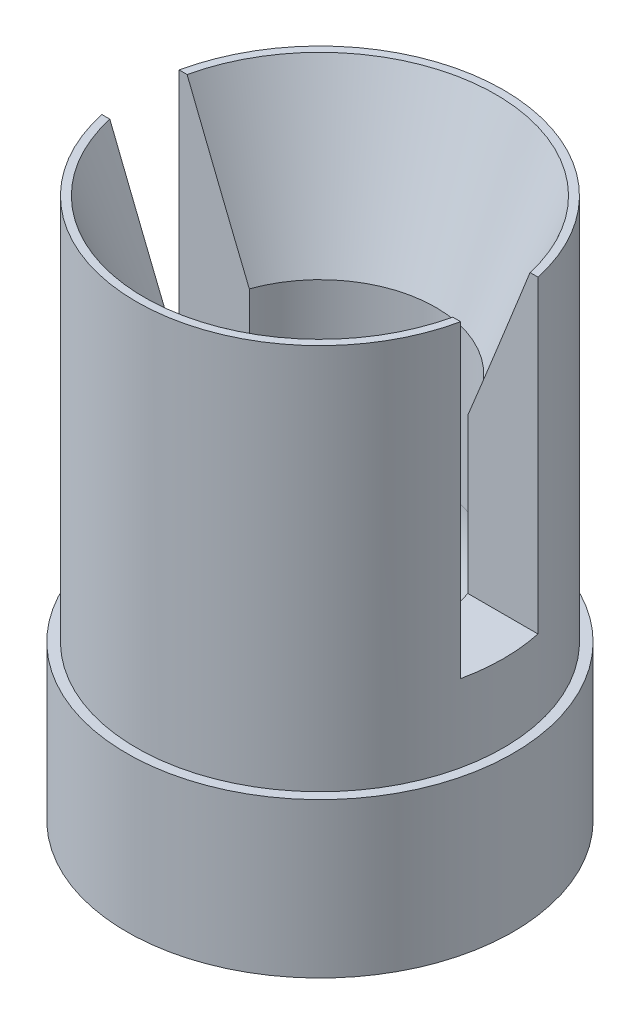
ISO-10303-21;
HEADER;
FILE_DESCRIPTION(('STEP AP214'),'2;1');
FILE_NAME('part.step','',(''),(''),'','','');
FILE_SCHEMA(('AUTOMOTIVE_DESIGN { 1 0 10303 214 1 1 1 1 }'));
ENDSEC;
DATA;
#1=APPLICATION_CONTEXT('core data for automotive mechanical design processes');
#2=APPLICATION_PROTOCOL_DEFINITION('international standard','automotive_design',2000,#1);
#3=PRODUCT_CONTEXT('',#1,'mechanical');
#4=PRODUCT('Part','Part','',(#3));
#5=PRODUCT_RELATED_PRODUCT_CATEGORY('part','',(#4));
#6=PRODUCT_DEFINITION_FORMATION('','',#4);
#7=PRODUCT_DEFINITION_CONTEXT('part definition',#1,'design');
#8=PRODUCT_DEFINITION('design','',#6,#7);
#9=PRODUCT_DEFINITION_SHAPE('','',#8);
#10=(LENGTH_UNIT() NAMED_UNIT(*) SI_UNIT(.MILLI.,.METRE.));
#11=(NAMED_UNIT(*) PLANE_ANGLE_UNIT() SI_UNIT($,.RADIAN.));
#12=(NAMED_UNIT(*) SI_UNIT($,.STERADIAN.) SOLID_ANGLE_UNIT());
#13=UNCERTAINTY_MEASURE_WITH_UNIT(LENGTH_MEASURE(1.E-05),#10,'distance_accuracy_value','');
#14=(GEOMETRIC_REPRESENTATION_CONTEXT(3) GLOBAL_UNCERTAINTY_ASSIGNED_CONTEXT((#13)) GLOBAL_UNIT_ASSIGNED_CONTEXT((#10,
#11,#12)) REPRESENTATION_CONTEXT('',''));
#15=CARTESIAN_POINT('',(0.,0.,0.));
#16=DIRECTION('',(0.,0.,1.));
#17=DIRECTION('',(1.,0.,0.));
#18=AXIS2_PLACEMENT_3D('',#15,#16,#17);
#19=CARTESIAN_POINT('',(0.,-3.50341772790597,0.));
#20=DIRECTION('',(0.,-1.,0.));
#21=DIRECTION('',(0.,0.,-1.));
#22=AXIS2_PLACEMENT_3D('',#19,#20,#21);
#23=CYLINDRICAL_SURFACE('',#22,3.);
#24=CARTESIAN_POINT('',(0.,10.,0.));
#25=DIRECTION('',(0.,-1.,0.));
#26=DIRECTION('',(0.,0.,-1.));
#27=AXIS2_PLACEMENT_3D('',#24,#25,#26);
#28=CIRCLE('',#27,3.);
#29=CARTESIAN_POINT('',(-2.82842712474619,10.,-1.));
#30=VERTEX_POINT('',#29);
#31=CARTESIAN_POINT('',(2.82842712474619,10.,-1.));
#32=VERTEX_POINT('',#31);
#33=EDGE_CURVE('E148',#30,#32,#28,.T.);
#34=ORIENTED_EDGE('',*,*,#33,.F.);
#35=DIRECTION('',(0.,-1.,0.));
#36=VECTOR('',#35,1.);
#37=CARTESIAN_POINT('',(-2.82842712474619,-3.50341772790597,-1.));
#38=LINE('',#37,#36);
#39=CARTESIAN_POINT('',(-2.82842712474619,6.,-1.));
#40=VERTEX_POINT('',#39);
#41=EDGE_CURVE('E120',#40,#30,#38,.F.);
#42=ORIENTED_EDGE('',*,*,#41,.F.);
#43=CARTESIAN_POINT('',(0.,6.,0.));
#44=DIRECTION('',(0.,-1.,0.));
#45=DIRECTION('',(0.,0.,-1.));
#46=AXIS2_PLACEMENT_3D('',#43,#44,#45);
#47=CIRCLE('',#46,3.);
#48=CARTESIAN_POINT('',(2.82842712474619,6.,-1.));
#49=VERTEX_POINT('',#48);
#50=EDGE_CURVE('E41',#40,#49,#47,.T.);
#51=ORIENTED_EDGE('',*,*,#50,.T.);
#52=DIRECTION('',(0.,-1.,0.));
#53=VECTOR('',#52,1.);
#54=CARTESIAN_POINT('',(2.82842712474619,-3.50341772790597,-1.));
#55=LINE('',#54,#53);
#56=EDGE_CURVE('E168',#49,#32,#55,.F.);
#57=ORIENTED_EDGE('',*,*,#56,.T.);
#58=EDGE_LOOP('',(#34,#42,#51,#57));
#59=FACE_BOUND('',#58,.T.);
#60=ADVANCED_FACE('F32',(#59),#23,.F.);
#61=CARTESIAN_POINT('',(0.,10.,0.));
#62=DIRECTION('',(0.,1.,0.));
#63=DIRECTION('',(0.,0.,1.));
#64=AXIS2_PLACEMENT_3D('',#61,#62,#63);
#65=CONICAL_SURFACE('',#64,3.,0.369684288795301);
#66=CARTESIAN_POINT('',(0.,14.,0.));
#67=DIRECTION('',(0.,-1.,0.));
#68=DIRECTION('',(0.,0.,-1.));
#69=AXIS2_PLACEMENT_3D('',#66,#67,#68);
#70=CIRCLE('',#69,4.55);
#71=CARTESIAN_POINT('',(-4.43874982399324,14.,-1.));
#72=VERTEX_POINT('',#71);
#73=CARTESIAN_POINT('',(4.43874982399324,14.,-1.));
#74=VERTEX_POINT('',#73);
#75=EDGE_CURVE('E140',#72,#74,#70,.T.);
#76=ORIENTED_EDGE('',*,*,#75,.F.);
#77=CARTESIAN_POINT('',(-1.42130511274065,6.74282801866641,-1.));
#78=CARTESIAN_POINT('',(-1.46687249735341,6.83903839617096,-1.));
#79=CARTESIAN_POINT('',(-1.51187462449016,6.93551370458948,-1.));
#80=CARTESIAN_POINT('',(-1.60094963701557,7.12888904259114,-1.));
#81=CARTESIAN_POINT('',(-1.64502255183199,7.22578905860621,-1.));
#82=CARTESIAN_POINT('',(-1.73243931522253,7.41990598798936,-1.));
#83=CARTESIAN_POINT('',(-1.77578322952742,7.517122871833,-1.));
#84=CARTESIAN_POINT('',(-1.8618790255143,7.71181928280967,-1.));
#85=CARTESIAN_POINT('',(-1.90463090174485,7.80929881235127,-1.));
#86=CARTESIAN_POINT('',(-2.03214641427029,8.1020169637841,-1.));
#87=CARTESIAN_POINT('',(-2.11618594382117,8.29757092757316,-1.));
#88=CARTESIAN_POINT('',(-2.28291151732341,8.68925942332778,-1.));
#89=CARTESIAN_POINT('',(-2.36559752403552,8.88539397109213,-1.));
#90=CARTESIAN_POINT('',(-2.53835038856168,9.29809466333288,-1.));
#91=CARTESIAN_POINT('',(-2.62831042752031,9.51470548410456,-1.));
#92=CARTESIAN_POINT('',(-2.80733548677005,9.94829364646269,-1.));
#93=CARTESIAN_POINT('',(-2.8964005157964,10.1652709844478,-1.));
#94=CARTESIAN_POINT('',(-3.16260720888507,10.8166581585263,-1.));
#95=CARTESIAN_POINT('',(-3.33874219795971,11.2514792002581,-1.));
#96=CARTESIAN_POINT('',(-3.68122880215228,12.1015891497653,-1.));
#97=CARTESIAN_POINT('',(-3.84765510788972,12.5168480492094,-1.));
#98=CARTESIAN_POINT('',(-4.17948286982598,13.3477753704594,-1.));
#99=CARTESIAN_POINT('',(-4.34488432522826,13.7634437925831,-1.));
#100=CARTESIAN_POINT('',(-4.6749259280216,14.5949664518623,-1.));
#101=CARTESIAN_POINT('',(-4.83956624944985,15.0108206199982,-1.));
#102=CARTESIAN_POINT('',(-5.16830298988397,15.8427421353563,-1.));
#103=CARTESIAN_POINT('',(-5.33239941091285,16.2588094817789,-1.));
#104=CARTESIAN_POINT('',(-5.49631311474116,16.674948560548,-1.));
#105=B_SPLINE_CURVE_WITH_KNOTS('',3,(#77,#78,#79,#80,#81,#82,#83,#84,#85,#86,#87,#88,#89,#90,
#91,#92,#93,#94,#95,#96,#97,#98,#99,#100,#101,#102,#103,#104),.UNSPECIFIED.,.F.,.F.,(4,2,2,2,2,
2,2,2,2,2,2,2,2,4),(0.,0.31936174339187,0.638713357494174,0.958036021007214,1.27736162286758,
1.91589524012645,2.55444639583224,3.25808939331585,3.96172551659022,5.3691405737959,
6.71124163388514,8.05334373698744,9.39512206142563,10.7368953895948),.UNSPECIFIED.);
#106=EDGE_CURVE('E115',#30,#72,#105,.T.);
#107=ORIENTED_EDGE('',*,*,#106,.F.);
#108=ORIENTED_EDGE('',*,*,#33,.T.);
#109=CARTESIAN_POINT('',(1.13854452280354,6.16864346501909,-1.));
#110=CARTESIAN_POINT('',(1.18110951610829,6.25123251436243,-1.));
#111=CARTESIAN_POINT('',(1.22289842755637,6.33421484072538,-1.));
#112=CARTESIAN_POINT('',(1.30521868303787,6.50079353967114,-1.));
#113=CARTESIAN_POINT('',(1.34575012842565,6.58438986208936,-1.));
#114=CARTESIAN_POINT('',(1.42584827978096,6.75201955062287,-1.));
#115=CARTESIAN_POINT('',(1.46541518987714,6.83605281961667,-1.));
#116=CARTESIAN_POINT('',(1.54378038572998,7.00447894052774,-1.));
#117=CARTESIAN_POINT('',(1.58257865345234,7.08887180082562,-1.));
#118=CARTESIAN_POINT('',(1.69801546041434,7.34240394134036,-1.));
#119=CARTESIAN_POINT('',(1.77372805785886,7.51196453826505,-1.));
#120=CARTESIAN_POINT('',(1.92345995952192,7.85184104202724,-1.));
#121=CARTESIAN_POINT('',(1.99747915472072,8.02215699665602,-1.));
#122=CARTESIAN_POINT('',(2.15085392894309,8.37858100963559,-1.));
#123=CARTESIAN_POINT('',(2.23009439398268,8.56473854427177,-1.));
#124=CARTESIAN_POINT('',(2.387503160546,8.93750032951421,-1.));
#125=CARTESIAN_POINT('',(2.46567148689,9.12410456966126,-1.));
#126=CARTESIAN_POINT('',(2.69900152607198,9.6844668620993,-1.));
#127=CARTESIAN_POINT('',(2.85296632251961,10.0587229526121,-1.));
#128=CARTESIAN_POINT('',(3.15259808166099,10.7924611974718,-1.));
#129=CARTESIAN_POINT('',(3.29834404718119,11.1519112122027,-1.));
#130=CARTESIAN_POINT('',(3.58862413115509,11.8712999194609,-1.));
#131=CARTESIAN_POINT('',(3.73315824992082,12.2312386118623,-1.));
#132=CARTESIAN_POINT('',(4.02136485780309,12.951432353474,-1.));
#133=CARTESIAN_POINT('',(4.16503740421451,13.3116873797797,-1.));
#134=CARTESIAN_POINT('',(4.45175430338885,14.0324470655695,-1.));
#135=CARTESIAN_POINT('',(4.59479865639335,14.3929517249576,-1.));
#136=CARTESIAN_POINT('',(5.08127898727471,15.6212937548632,-1.));
#137=CARTESIAN_POINT('',(5.42360582798485,16.4895702432941,-1.));
#138=CARTESIAN_POINT('',(6.10678156681992,18.2267051282026,-1.));
#139=CARTESIAN_POINT('',(6.44763046261275,19.0955635255959,-1.));
#140=CARTESIAN_POINT('',(7.1284383875806,20.833716892008,-1.));
#141=CARTESIAN_POINT('',(7.46839733591351,21.7030118926851,-1.));
#142=CARTESIAN_POINT('',(8.14768271681911,23.44184550829,-1.));
#143=CARTESIAN_POINT('',(8.48700915161062,24.3113841223508,-1.));
#144=CARTESIAN_POINT('',(8.82616423737579,25.1809892779169,-1.));
#145=B_SPLINE_CURVE_WITH_KNOTS('',3,(#109,#110,#111,#112,#113,#114,#115,#116,#117,#118,#119,
#120,#121,#122,#123,#124,#125,#126,#127,#128,#129,#130,#131,#132,#133,#134,#135,#136,#137,#138,
#139,#140,#141,#142,#143,#144),.UNSPECIFIED.,.F.,.F.,(4,2,2,2,2,2,2,2,2,2,2,2,2,2,2,2,2,4),(0.,
0.278724820421122,0.557427116367443,0.836069908103565,1.1147192297835,1.67179302860725,
2.22890259099677,2.83585994409617,3.44280322219186,4.6568578440084,5.82047741999087,
6.98409669633826,8.14763771382566,9.31117828381937,12.1111440456248,14.9111142239979,
17.7113304881812,20.5115369107457),.UNSPECIFIED.);
#146=EDGE_CURVE('E160',#32,#74,#145,.T.);
#147=ORIENTED_EDGE('',*,*,#146,.T.);
#148=EDGE_LOOP('',(#76,#107,#108,#147));
#149=FACE_BOUND('',#148,.T.);
#150=ADVANCED_FACE('F159',(#149),#65,.F.);
#151=CARTESIAN_POINT('',(-4.75,14.,0.));
#152=DIRECTION('',(0.,-1.,0.));
#153=DIRECTION('',(0.,0.,-1.));
#154=AXIS2_PLACEMENT_3D('',#151,#152,#153);
#155=PLANE('',#154);
#156=CARTESIAN_POINT('',(0.,14.,0.));
#157=DIRECTION('',(0.,-1.,0.));
#158=DIRECTION('',(0.,0.,-1.));
#159=AXIS2_PLACEMENT_3D('',#156,#157,#158);
#160=CIRCLE('',#159,4.75);
#161=CARTESIAN_POINT('',(-4.64354390525168,14.,-1.));
#162=VERTEX_POINT('',#161);
#163=CARTESIAN_POINT('',(4.64354390525168,14.,-1.));
#164=VERTEX_POINT('',#163);
#165=EDGE_CURVE('E125',#162,#164,#160,.T.);
#166=ORIENTED_EDGE('',*,*,#165,.F.);
#167=DIRECTION('',(1.,0.,0.));
#168=VECTOR('',#167,1.);
#169=CARTESIAN_POINT('',(-5.001,14.,-1.));
#170=LINE('',#169,#168);
#171=EDGE_CURVE('E109',#162,#72,#170,.T.);
#172=ORIENTED_EDGE('',*,*,#171,.T.);
#173=ORIENTED_EDGE('',*,*,#75,.T.);
#174=DIRECTION('',(-1.,0.,0.));
#175=VECTOR('',#174,1.);
#176=CARTESIAN_POINT('',(5.001,14.,-1.));
#177=LINE('',#176,#175);
#178=EDGE_CURVE('E135',#164,#74,#177,.T.);
#179=ORIENTED_EDGE('',*,*,#178,.F.);
#180=EDGE_LOOP('',(#166,#172,#173,#179));
#181=FACE_BOUND('',#180,.T.);
#182=ADVANCED_FACE('F133',(#181),#155,.F.);
#183=CARTESIAN_POINT('',(2.82842712474619,6.,1.));
#184=VERTEX_POINT('',#183);
#185=CARTESIAN_POINT('',(-2.82842712474619,6.,1.));
#186=VERTEX_POINT('',#185);
#187=EDGE_CURVE('E40',#184,#186,#47,.T.);
#188=ORIENTED_EDGE('',*,*,#187,.T.);
#189=DIRECTION('',(0.,-1.,0.));
#190=VECTOR('',#189,1.);
#191=CARTESIAN_POINT('',(-2.82842712474619,-3.50341772790597,1.));
#192=LINE('',#191,#190);
#193=CARTESIAN_POINT('',(-2.82842712474619,9.99999999999999,1.));
#194=VERTEX_POINT('',#193);
#195=EDGE_CURVE('E48',#194,#186,#192,.T.);
#196=ORIENTED_EDGE('',*,*,#195,.F.);
#197=CARTESIAN_POINT('',(2.82842712474619,10.,1.));
#198=VERTEX_POINT('',#197);
#199=EDGE_CURVE('E149',#198,#194,#28,.T.);
#200=ORIENTED_EDGE('',*,*,#199,.F.);
#201=DIRECTION('',(0.,-1.,0.));
#202=VECTOR('',#201,1.);
#203=CARTESIAN_POINT('',(2.82842712474619,-3.50341772790597,1.));
#204=LINE('',#203,#202);
#205=EDGE_CURVE('E173',#198,#184,#204,.T.);
#206=ORIENTED_EDGE('',*,*,#205,.T.);
#207=EDGE_LOOP('',(#188,#196,#200,#206));
#208=FACE_BOUND('',#207,.T.);
#209=ADVANCED_FACE('F218',(#208),#23,.F.);
#210=ORIENTED_EDGE('',*,*,#199,.T.);
#211=CARTESIAN_POINT('',(-5.49631311474116,16.674948560548,1.));
#212=CARTESIAN_POINT('',(-5.33236726545176,16.2587281029965,1.));
#213=CARTESIAN_POINT('',(-5.16823874175081,15.842579352962,1.));
#214=CARTESIAN_POINT('',(-4.83944129181858,15.0105045974139,1.));
#215=CARTESIAN_POINT('',(-4.67477237593511,14.5945785878105,1.));
#216=CARTESIAN_POINT('',(-4.34473371115412,13.7630653247091,1.));
#217=CARTESIAN_POINT('',(-4.17936405343854,13.3474780350484,1.));
#218=CARTESIAN_POINT('',(-3.84759753995541,12.5167037010042,1.));
#219=CARTESIAN_POINT('',(-3.68120066338843,12.1015166649233,1.));
#220=CARTESIAN_POINT('',(-3.34687229084607,11.2716621125102,1.));
#221=CARTESIAN_POINT('',(-3.17894049204518,10.8569947178852,1.));
#222=CARTESIAN_POINT('',(-2.92525670509561,10.2357348530482,1.));
#223=CARTESIAN_POINT('',(-2.84039992750452,10.0287769880307,1.));
#224=CARTESIAN_POINT('',(-2.66990318591931,9.61518123385953,1.));
#225=CARTESIAN_POINT('',(-2.58426321386999,9.4085433480224,1.));
#226=CARTESIAN_POINT('',(-2.41192883440908,8.99566155143605,1.));
#227=CARTESIAN_POINT('',(-2.3252342310374,8.78941772240517,1.));
#228=CARTESIAN_POINT('',(-2.15042424810812,8.37753790710662,1.));
#229=CARTESIAN_POINT('',(-2.06230890890322,8.1719019037707,1.));
#230=CARTESIAN_POINT('',(-1.92858869398113,7.86409804189986,1.));
#231=CARTESIAN_POINT('',(-1.88375335520285,7.76159600260509,1.));
#232=CARTESIAN_POINT('',(-1.793448569176,7.5568726203993,1.));
#233=CARTESIAN_POINT('',(-1.74797912833147,7.45465127466591,1.));
#234=CARTESIAN_POINT('',(-1.65625337528664,7.25054951865592,1.));
#235=CARTESIAN_POINT('',(-1.60999698836631,7.14866914186563,1.));
#236=CARTESIAN_POINT('',(-1.51646942486942,6.94537142939698,1.));
#237=CARTESIAN_POINT('',(-1.46919821302836,6.84395410995855,1.));
#238=CARTESIAN_POINT('',(-1.42130511274065,6.74282801866641,1.));
#239=B_SPLINE_CURVE_WITH_KNOTS('',3,(#211,#212,#213,#214,#215,#216,#217,#218,#219,#220,#221,
#222,#223,#224,#225,#226,#227,#228,#229,#230,#231,#232,#233,#234,#235,#236,#237,#238),
.UNSPECIFIED.,.F.,.F.,(4,2,2,2,2,2,2,2,2,2,2,2,2,4),(0.,1.34203583568066,2.68404612132428,
4.02588683880831,5.36775481599974,6.70989350491945,7.38092894725192,8.05197129900565,
8.72314030112211,9.39429027371375,9.72992510987282,10.065556558782,10.4012200555422,
10.7368952353296),.UNSPECIFIED.);
#240=CARTESIAN_POINT('',(-4.43874982399324,14.,1.));
#241=VERTEX_POINT('',#240);
#242=EDGE_CURVE('E130',#241,#194,#239,.T.);
#243=ORIENTED_EDGE('',*,*,#242,.F.);
#244=CARTESIAN_POINT('',(4.43874982399324,14.,1.));
#245=VERTEX_POINT('',#244);
#246=EDGE_CURVE('E146',#245,#241,#70,.T.);
#247=ORIENTED_EDGE('',*,*,#246,.F.);
#248=CARTESIAN_POINT('',(1.13854452280354,6.16864346501909,1.));
#249=CARTESIAN_POINT('',(1.18110951610829,6.25123251436243,1.));
#250=CARTESIAN_POINT('',(1.22289842755637,6.33421484072538,1.));
#251=CARTESIAN_POINT('',(1.30521868303787,6.50079353967114,1.));
#252=CARTESIAN_POINT('',(1.34575012842565,6.58438986208936,1.));
#253=CARTESIAN_POINT('',(1.42584827978096,6.75201955062287,1.));
#254=CARTESIAN_POINT('',(1.46541518987714,6.83605281961667,1.));
#255=CARTESIAN_POINT('',(1.54378038572998,7.00447894052774,1.));
#256=CARTESIAN_POINT('',(1.58257865345234,7.08887180082562,1.));
#257=CARTESIAN_POINT('',(1.69801546041434,7.34240394134036,1.));
#258=CARTESIAN_POINT('',(1.77372805785886,7.51196453826505,1.));
#259=CARTESIAN_POINT('',(1.92345995952192,7.85184104202724,1.));
#260=CARTESIAN_POINT('',(1.99747915472072,8.02215699665602,1.));
#261=CARTESIAN_POINT('',(2.15085392894309,8.37858100963559,1.));
#262=CARTESIAN_POINT('',(2.23009439398268,8.56473854427177,1.));
#263=CARTESIAN_POINT('',(2.387503160546,8.93750032951421,1.));
#264=CARTESIAN_POINT('',(2.46567148689,9.12410456966126,1.));
#265=CARTESIAN_POINT('',(2.69900152607198,9.6844668620993,1.));
#266=CARTESIAN_POINT('',(2.85296632251961,10.0587229526121,1.));
#267=CARTESIAN_POINT('',(3.15259808166099,10.7924611974718,1.));
#268=CARTESIAN_POINT('',(3.29834404718119,11.1519112122027,1.));
#269=CARTESIAN_POINT('',(3.58862413115509,11.8712999194609,1.));
#270=CARTESIAN_POINT('',(3.73315824992082,12.2312386118623,1.));
#271=CARTESIAN_POINT('',(4.02136485780309,12.951432353474,1.));
#272=CARTESIAN_POINT('',(4.16503740421451,13.3116873797797,1.));
#273=CARTESIAN_POINT('',(4.45175430338885,14.0324470655695,1.));
#274=CARTESIAN_POINT('',(4.59479865639335,14.3929517249576,1.));
#275=CARTESIAN_POINT('',(5.08127898727471,15.6212937548632,1.));
#276=CARTESIAN_POINT('',(5.42360582798485,16.4895702432941,1.));
#277=CARTESIAN_POINT('',(6.10678156681992,18.2267051282026,1.));
#278=CARTESIAN_POINT('',(6.44763046261275,19.0955635255959,1.));
#279=CARTESIAN_POINT('',(7.1284383875806,20.833716892008,1.));
#280=CARTESIAN_POINT('',(7.46839733591351,21.7030118926851,1.));
#281=CARTESIAN_POINT('',(8.14768271681911,23.44184550829,1.));
#282=CARTESIAN_POINT('',(8.48700915161062,24.3113841223508,1.));
#283=CARTESIAN_POINT('',(8.82616423737579,25.1809892779169,1.));
#284=B_SPLINE_CURVE_WITH_KNOTS('',3,(#248,#249,#250,#251,#252,#253,#254,#255,#256,#257,#258,
#259,#260,#261,#262,#263,#264,#265,#266,#267,#268,#269,#270,#271,#272,#273,#274,#275,#276,#277,
#278,#279,#280,#281,#282,#283),.UNSPECIFIED.,.F.,.F.,(4,2,2,2,2,2,2,2,2,2,2,2,2,2,2,2,2,4),(0.,
0.278724820421122,0.557427116367443,0.836069908103565,1.1147192297835,1.67179302860725,
2.22890259099677,2.83585994409617,3.44280322219186,4.6568578440084,5.82047741999087,
6.98409669633826,8.14763771382566,9.31117828381937,12.1111440456248,14.9111142239979,
17.7113304881812,20.5115369107457),.UNSPECIFIED.);
#285=EDGE_CURVE('E198',#245,#198,#284,.F.);
#286=ORIENTED_EDGE('',*,*,#285,.T.);
#287=EDGE_LOOP('',(#210,#243,#247,#286));
#288=FACE_BOUND('',#287,.T.);
#289=ADVANCED_FACE('F223',(#288),#65,.F.);
#290=ORIENTED_EDGE('',*,*,#246,.T.);
#291=DIRECTION('',(1.,0.,0.));
#292=VECTOR('',#291,1.);
#293=CARTESIAN_POINT('',(-5.001,14.,1.));
#294=LINE('',#293,#292);
#295=CARTESIAN_POINT('',(-4.64354390525168,14.,1.));
#296=VERTEX_POINT('',#295);
#297=EDGE_CURVE('E119',#296,#241,#294,.T.);
#298=ORIENTED_EDGE('',*,*,#297,.F.);
#299=CARTESIAN_POINT('',(4.64354390525168,14.,1.));
#300=VERTEX_POINT('',#299);
#301=EDGE_CURVE('E136',#300,#296,#160,.T.);
#302=ORIENTED_EDGE('',*,*,#301,.F.);
#303=DIRECTION('',(-1.,0.,0.));
#304=VECTOR('',#303,1.);
#305=CARTESIAN_POINT('',(5.001,14.,1.));
#306=LINE('',#305,#304);
#307=EDGE_CURVE('E376',#300,#245,#306,.T.);
#308=ORIENTED_EDGE('',*,*,#307,.T.);
#309=EDGE_LOOP('',(#290,#298,#302,#308));
#310=FACE_BOUND('',#309,.T.);
#311=ADVANCED_FACE('F230',(#310),#155,.F.);
#312=CARTESIAN_POINT('',(0.,-3.50341772790597,0.));
#313=DIRECTION('',(0.,-1.,0.));
#314=DIRECTION('',(0.,0.,-1.));
#315=AXIS2_PLACEMENT_3D('',#312,#313,#314);
#316=CYLINDRICAL_SURFACE('',#315,4.75);
#317=CARTESIAN_POINT('',(0.,4.,0.));
#318=DIRECTION('',(0.,-1.,0.));
#319=DIRECTION('',(0.,0.,-1.));
#320=AXIS2_PLACEMENT_3D('',#317,#318,#319);
#321=CIRCLE('',#320,4.75);
#322=CARTESIAN_POINT('',(0.,4.,-4.75));
#323=VERTEX_POINT('',#322);
#324=EDGE_CURVE('E137',#323,#323,#321,.T.);
#325=ORIENTED_EDGE('',*,*,#324,.F.);
#326=EDGE_LOOP('',(#325));
#327=FACE_BOUND('',#326,.T.);
#328=CARTESIAN_POINT('',(0.,6.,0.));
#329=DIRECTION('',(0.,-1.,0.));
#330=DIRECTION('',(0.,0.,-1.));
#331=AXIS2_PLACEMENT_3D('',#328,#329,#330);
#332=CIRCLE('',#331,4.75);
#333=CARTESIAN_POINT('',(-4.64354390525168,6.,-1.));
#334=VERTEX_POINT('',#333);
#335=CARTESIAN_POINT('',(-4.64354390525168,6.,1.));
#336=VERTEX_POINT('',#335);
#337=EDGE_CURVE('E129',#334,#336,#332,.F.);
#338=ORIENTED_EDGE('',*,*,#337,.F.);
#339=DIRECTION('',(0.,-1.,0.));
#340=VECTOR('',#339,1.);
#341=CARTESIAN_POINT('',(-4.64354390525168,-3.50341772790597,-1.));
#342=LINE('',#341,#340);
#343=EDGE_CURVE('E112',#162,#334,#342,.T.);
#344=ORIENTED_EDGE('',*,*,#343,.F.);
#345=ORIENTED_EDGE('',*,*,#165,.T.);
#346=DIRECTION('',(0.,-1.,0.));
#347=VECTOR('',#346,1.);
#348=CARTESIAN_POINT('',(4.64354390525168,-3.50341772790597,-1.));
#349=LINE('',#348,#347);
#350=CARTESIAN_POINT('',(4.64354390525168,6.,-1.));
#351=VERTEX_POINT('',#350);
#352=EDGE_CURVE('E176',#164,#351,#349,.T.);
#353=ORIENTED_EDGE('',*,*,#352,.T.);
#354=CARTESIAN_POINT('',(0.,6.,0.));
#355=DIRECTION('',(0.,1.,0.));
#356=DIRECTION('',(0.,0.,1.));
#357=AXIS2_PLACEMENT_3D('',#354,#355,#356);
#358=CIRCLE('',#357,4.75);
#359=CARTESIAN_POINT('',(4.64354390525168,6.,1.));
#360=VERTEX_POINT('',#359);
#361=EDGE_CURVE('E206',#351,#360,#358,.F.);
#362=ORIENTED_EDGE('',*,*,#361,.T.);
#363=DIRECTION('',(0.,-1.,0.));
#364=VECTOR('',#363,1.);
#365=CARTESIAN_POINT('',(4.64354390525168,-3.50341772790597,1.));
#366=LINE('',#365,#364);
#367=EDGE_CURVE('E384',#360,#300,#366,.F.);
#368=ORIENTED_EDGE('',*,*,#367,.T.);
#369=ORIENTED_EDGE('',*,*,#301,.T.);
#370=DIRECTION('',(0.,-1.,0.));
#371=VECTOR('',#370,1.);
#372=CARTESIAN_POINT('',(-4.64354390525168,-3.50341772790597,1.));
#373=LINE('',#372,#371);
#374=EDGE_CURVE('E240',#336,#296,#373,.F.);
#375=ORIENTED_EDGE('',*,*,#374,.F.);
#376=EDGE_LOOP('',(#338,#344,#345,#353,#362,#368,#369,#375));
#377=FACE_BOUND('',#376,.T.);
#378=ADVANCED_FACE('F123',(#327,#377),#316,.T.);
#379=CARTESIAN_POINT('',(0.,6.,0.));
#380=DIRECTION('',(0.,-1.,0.));
#381=DIRECTION('',(-1.,0.,0.));
#382=AXIS2_PLACEMENT_3D('',#379,#380,#381);
#383=SPHERICAL_SURFACE('',#382,3.);
#384=EDGE_CURVE('E11',#49,#184,#47,.T.);
#385=ORIENTED_EDGE('',*,*,#384,.F.);
#386=ORIENTED_EDGE('',*,*,#50,.F.);
#387=CARTESIAN_POINT('',(0.,6.,0.));
#388=DIRECTION('',(0.,-1.,0.));
#389=DIRECTION('',(0.,0.,-1.));
#390=AXIS2_PLACEMENT_3D('',#387,#388,#389);
#391=CIRCLE('',#390,3.);
#392=EDGE_CURVE('E238',#186,#40,#391,.T.);
#393=ORIENTED_EDGE('',*,*,#392,.F.);
#394=ORIENTED_EDGE('',*,*,#187,.F.);
#395=EDGE_LOOP('',(#385,#386,#393,#394));
#396=FACE_BOUND('',#395,.T.);
#397=ADVANCED_FACE('F34',(#396),#383,.F.);
#398=CARTESIAN_POINT('',(-5.,4.,0.));
#399=DIRECTION('',(0.,-1.,0.));
#400=DIRECTION('',(0.,0.,-1.));
#401=AXIS2_PLACEMENT_3D('',#398,#399,#400);
#402=PLANE('',#401);
#403=CARTESIAN_POINT('',(0.,4.,0.));
#404=DIRECTION('',(0.,-1.,0.));
#405=DIRECTION('',(0.,0.,-1.));
#406=AXIS2_PLACEMENT_3D('',#403,#404,#405);
#407=CIRCLE('',#406,5.);
#408=CARTESIAN_POINT('',(0.,4.,-5.));
#409=VERTEX_POINT('',#408);
#410=EDGE_CURVE('E142',#409,#409,#407,.T.);
#411=ORIENTED_EDGE('',*,*,#410,.F.);
#412=EDGE_LOOP('',(#411));
#413=FACE_BOUND('',#412,.T.);
#414=ORIENTED_EDGE('',*,*,#324,.T.);
#415=EDGE_LOOP('',(#414));
#416=FACE_BOUND('',#415,.T.);
#417=ADVANCED_FACE('F294',(#413,#416),#402,.F.);
#418=CARTESIAN_POINT('',(0.,-3.50341772790597,0.));
#419=DIRECTION('',(0.,-1.,0.));
#420=DIRECTION('',(0.,0.,-1.));
#421=AXIS2_PLACEMENT_3D('',#418,#419,#420);
#422=CYLINDRICAL_SURFACE('',#421,5.);
#423=CARTESIAN_POINT('',(0.,0.,0.));
#424=DIRECTION('',(0.,-1.,0.));
#425=DIRECTION('',(0.,0.,-1.));
#426=AXIS2_PLACEMENT_3D('',#423,#424,#425);
#427=CIRCLE('',#426,5.);
#428=CARTESIAN_POINT('',(0.,0.,-5.));
#429=VERTEX_POINT('',#428);
#430=EDGE_CURVE('E205',#429,#429,#427,.T.);
#431=ORIENTED_EDGE('',*,*,#430,.F.);
#432=EDGE_LOOP('',(#431));
#433=FACE_BOUND('',#432,.T.);
#434=ORIENTED_EDGE('',*,*,#410,.T.);
#435=EDGE_LOOP('',(#434));
#436=FACE_BOUND('',#435,.T.);
#437=ADVANCED_FACE('F345',(#433,#436),#422,.T.);
#438=CARTESIAN_POINT('',(0.,0.,0.));
#439=DIRECTION('',(0.,1.,0.));
#440=DIRECTION('',(0.,0.,1.));
#441=AXIS2_PLACEMENT_3D('',#438,#439,#440);
#442=PLANE('',#441);
#443=ORIENTED_EDGE('',*,*,#430,.T.);
#444=EDGE_LOOP('',(#443));
#445=FACE_BOUND('',#444,.T.);
#446=ADVANCED_FACE('F216',(#445),#442,.F.);
#447=CARTESIAN_POINT('',(5.001,6.,-1.));
#448=DIRECTION('',(0.,0.,1.));
#449=DIRECTION('',(1.,0.,0.));
#450=AXIS2_PLACEMENT_3D('',#447,#448,#449);
#451=PLANE('',#450);
#452=DIRECTION('',(-1.,0.,0.));
#453=VECTOR('',#452,1.);
#454=CARTESIAN_POINT('',(5.001,6.,-1.));
#455=LINE('',#454,#453);
#456=EDGE_CURVE('E170',#351,#49,#455,.T.);
#457=ORIENTED_EDGE('',*,*,#456,.F.);
#458=ORIENTED_EDGE('',*,*,#352,.F.);
#459=ORIENTED_EDGE('',*,*,#178,.T.);
#460=ORIENTED_EDGE('',*,*,#146,.F.);
#461=ORIENTED_EDGE('',*,*,#56,.F.);
#462=EDGE_LOOP('',(#457,#458,#459,#460,#461));
#463=FACE_BOUND('',#462,.T.);
#464=ADVANCED_FACE('F167',(#463),#451,.T.);
#465=CARTESIAN_POINT('',(5.001,6.,1.));
#466=DIRECTION('',(0.,0.,-1.));
#467=DIRECTION('',(-1.,0.,0.));
#468=AXIS2_PLACEMENT_3D('',#465,#466,#467);
#469=PLANE('',#468);
#470=ORIENTED_EDGE('',*,*,#285,.F.);
#471=ORIENTED_EDGE('',*,*,#307,.F.);
#472=ORIENTED_EDGE('',*,*,#367,.F.);
#473=DIRECTION('',(-1.,0.,0.));
#474=VECTOR('',#473,1.);
#475=CARTESIAN_POINT('',(5.001,6.,1.));
#476=LINE('',#475,#474);
#477=EDGE_CURVE('E55',#360,#184,#476,.T.);
#478=ORIENTED_EDGE('',*,*,#477,.T.);
#479=ORIENTED_EDGE('',*,*,#205,.F.);
#480=EDGE_LOOP('',(#470,#471,#472,#478,#479));
#481=FACE_BOUND('',#480,.T.);
#482=ADVANCED_FACE('F208',(#481),#469,.T.);
#483=CARTESIAN_POINT('',(5.001,6.,1.));
#484=DIRECTION('',(0.,1.,0.));
#485=DIRECTION('',(0.,0.,1.));
#486=AXIS2_PLACEMENT_3D('',#483,#484,#485);
#487=PLANE('',#486);
#488=ORIENTED_EDGE('',*,*,#477,.F.);
#489=ORIENTED_EDGE('',*,*,#361,.F.);
#490=ORIENTED_EDGE('',*,*,#456,.T.);
#491=ORIENTED_EDGE('',*,*,#384,.T.);
#492=EDGE_LOOP('',(#488,#489,#490,#491));
#493=FACE_BOUND('',#492,.T.);
#494=ADVANCED_FACE('F195',(#493),#487,.T.);
#495=CARTESIAN_POINT('',(-5.001,6.,-1.));
#496=DIRECTION('',(0.,0.,-1.));
#497=DIRECTION('',(-1.,0.,0.));
#498=AXIS2_PLACEMENT_3D('',#495,#496,#497);
#499=PLANE('',#498);
#500=ORIENTED_EDGE('',*,*,#41,.T.);
#501=ORIENTED_EDGE('',*,*,#106,.T.);
#502=ORIENTED_EDGE('',*,*,#171,.F.);
#503=ORIENTED_EDGE('',*,*,#343,.T.);
#504=DIRECTION('',(1.,0.,0.));
#505=VECTOR('',#504,1.);
#506=CARTESIAN_POINT('',(-5.001,6.,-1.));
#507=LINE('',#506,#505);
#508=EDGE_CURVE('E379',#334,#40,#507,.T.);
#509=ORIENTED_EDGE('',*,*,#508,.T.);
#510=EDGE_LOOP('',(#500,#501,#502,#503,#509));
#511=FACE_BOUND('',#510,.T.);
#512=ADVANCED_FACE('F111',(#511),#499,.F.);
#513=CARTESIAN_POINT('',(-5.001,6.,1.));
#514=DIRECTION('',(0.,-1.,0.));
#515=DIRECTION('',(0.,0.,-1.));
#516=AXIS2_PLACEMENT_3D('',#513,#514,#515);
#517=PLANE('',#516);
#518=ORIENTED_EDGE('',*,*,#392,.T.);
#519=ORIENTED_EDGE('',*,*,#508,.F.);
#520=ORIENTED_EDGE('',*,*,#337,.T.);
#521=DIRECTION('',(1.,0.,0.));
#522=VECTOR('',#521,1.);
#523=CARTESIAN_POINT('',(-5.001,6.,1.));
#524=LINE('',#523,#522);
#525=EDGE_CURVE('E377',#336,#186,#524,.T.);
#526=ORIENTED_EDGE('',*,*,#525,.T.);
#527=EDGE_LOOP('',(#518,#519,#520,#526));
#528=FACE_BOUND('',#527,.T.);
#529=ADVANCED_FACE('F260',(#528),#517,.F.);
#530=CARTESIAN_POINT('',(-5.001,6.,1.));
#531=DIRECTION('',(0.,0.,1.));
#532=DIRECTION('',(1.,0.,0.));
#533=AXIS2_PLACEMENT_3D('',#530,#531,#532);
#534=PLANE('',#533);
#535=ORIENTED_EDGE('',*,*,#195,.T.);
#536=ORIENTED_EDGE('',*,*,#525,.F.);
#537=ORIENTED_EDGE('',*,*,#374,.T.);
#538=ORIENTED_EDGE('',*,*,#297,.T.);
#539=ORIENTED_EDGE('',*,*,#242,.T.);
#540=EDGE_LOOP('',(#535,#536,#537,#538,#539));
#541=FACE_BOUND('',#540,.T.);
#542=ADVANCED_FACE('F256',(#541),#534,.F.);
#543=CLOSED_SHELL('',(#60,#150,#182,#209,#289,#311,#378,#397,#417,#437,#446,#464,#482,#494,#512,
#529,#542));
#544=MANIFOLD_SOLID_BREP('B2',#543);
#545=ADVANCED_BREP_SHAPE_REPRESENTATION('',(#18,#544),#14);
#546=SHAPE_DEFINITION_REPRESENTATION(#9,#545);
ENDSEC;
END-ISO-10303-21;
